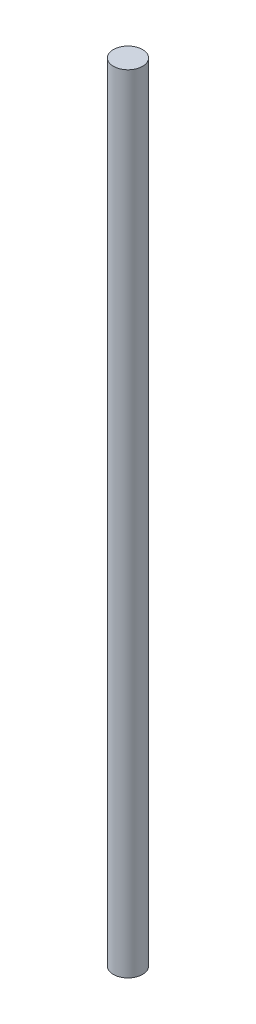
ISO-10303-21;
HEADER;
FILE_DESCRIPTION(('STEP AP214'),'2;1');
FILE_NAME('part.step','',(''),(''),'','','');
FILE_SCHEMA(('AUTOMOTIVE_DESIGN { 1 0 10303 214 1 1 1 1 }'));
ENDSEC;
DATA;
#1=APPLICATION_CONTEXT('core data for automotive mechanical design processes');
#2=APPLICATION_PROTOCOL_DEFINITION('international standard','automotive_design',2000,#1);
#3=PRODUCT_CONTEXT('',#1,'mechanical');
#4=PRODUCT('Part','Part','',(#3));
#5=PRODUCT_RELATED_PRODUCT_CATEGORY('part','',(#4));
#6=PRODUCT_DEFINITION_FORMATION('','',#4);
#7=PRODUCT_DEFINITION_CONTEXT('part definition',#1,'design');
#8=PRODUCT_DEFINITION('design','',#6,#7);
#9=PRODUCT_DEFINITION_SHAPE('','',#8);
#10=(LENGTH_UNIT() NAMED_UNIT(*) SI_UNIT(.MILLI.,.METRE.));
#11=(NAMED_UNIT(*) PLANE_ANGLE_UNIT() SI_UNIT($,.RADIAN.));
#12=(NAMED_UNIT(*) SI_UNIT($,.STERADIAN.) SOLID_ANGLE_UNIT());
#13=UNCERTAINTY_MEASURE_WITH_UNIT(LENGTH_MEASURE(1.E-05),#10,'distance_accuracy_value','');
#14=(GEOMETRIC_REPRESENTATION_CONTEXT(3) GLOBAL_UNCERTAINTY_ASSIGNED_CONTEXT((#13)) GLOBAL_UNIT_ASSIGNED_CONTEXT((#10,
#11,#12)) REPRESENTATION_CONTEXT('',''));
#15=CARTESIAN_POINT('',(0.,0.,0.));
#16=DIRECTION('',(0.,0.,1.));
#17=DIRECTION('',(1.,0.,0.));
#18=AXIS2_PLACEMENT_3D('',#15,#16,#17);
#19=CARTESIAN_POINT('',(1.32839080459768,270.,0.));
#20=DIRECTION('',(0.,-1.,0.));
#21=DIRECTION('',(0.,0.,-1.));
#22=AXIS2_PLACEMENT_3D('',#19,#20,#21);
#23=CYLINDRICAL_SURFACE('',#22,5.);
#24=CARTESIAN_POINT('',(1.32839080459768,270.,0.));
#25=DIRECTION('',(0.,1.,0.));
#26=DIRECTION('',(0.,0.,1.));
#27=AXIS2_PLACEMENT_3D('',#24,#25,#26);
#28=CIRCLE('',#27,5.);
#29=CARTESIAN_POINT('',(1.32839080459768,270.,5.));
#30=VERTEX_POINT('',#29);
#31=EDGE_CURVE('E10',#30,#30,#28,.T.);
#32=ORIENTED_EDGE('',*,*,#31,.F.);
#33=EDGE_LOOP('',(#32));
#34=FACE_BOUND('',#33,.T.);
#35=CARTESIAN_POINT('',(1.32839080459768,0.,0.));
#36=DIRECTION('',(0.,1.,0.));
#37=DIRECTION('',(0.,0.,1.));
#38=AXIS2_PLACEMENT_3D('',#35,#36,#37);
#39=CIRCLE('',#38,5.);
#40=CARTESIAN_POINT('',(1.32839080459768,0.,5.));
#41=VERTEX_POINT('',#40);
#42=EDGE_CURVE('E44',#41,#41,#39,.T.);
#43=ORIENTED_EDGE('',*,*,#42,.T.);
#44=EDGE_LOOP('',(#43));
#45=FACE_BOUND('',#44,.T.);
#46=ADVANCED_FACE('F41',(#34,#45),#23,.T.);
#47=CARTESIAN_POINT('',(1.32839080459768,270.,0.));
#48=DIRECTION('',(0.,1.,0.));
#49=DIRECTION('',(0.,0.,1.));
#50=AXIS2_PLACEMENT_3D('',#47,#48,#49);
#51=PLANE('',#50);
#52=ORIENTED_EDGE('',*,*,#31,.T.);
#53=EDGE_LOOP('',(#52));
#54=FACE_BOUND('',#53,.T.);
#55=ADVANCED_FACE('F60',(#54),#51,.T.);
#56=CARTESIAN_POINT('',(1.32839080459768,0.,0.));
#57=DIRECTION('',(0.,1.,0.));
#58=DIRECTION('',(0.,0.,1.));
#59=AXIS2_PLACEMENT_3D('',#56,#57,#58);
#60=PLANE('',#59);
#61=ORIENTED_EDGE('',*,*,#42,.F.);
#62=EDGE_LOOP('',(#61));
#63=FACE_BOUND('',#62,.T.);
#64=ADVANCED_FACE('F58',(#63),#60,.F.);
#65=CLOSED_SHELL('',(#46,#55,#64));
#66=MANIFOLD_SOLID_BREP('B2',#65);
#67=ADVANCED_BREP_SHAPE_REPRESENTATION('',(#18,#66),#14);
#68=SHAPE_DEFINITION_REPRESENTATION(#9,#67);
ENDSEC;
END-ISO-10303-21;
